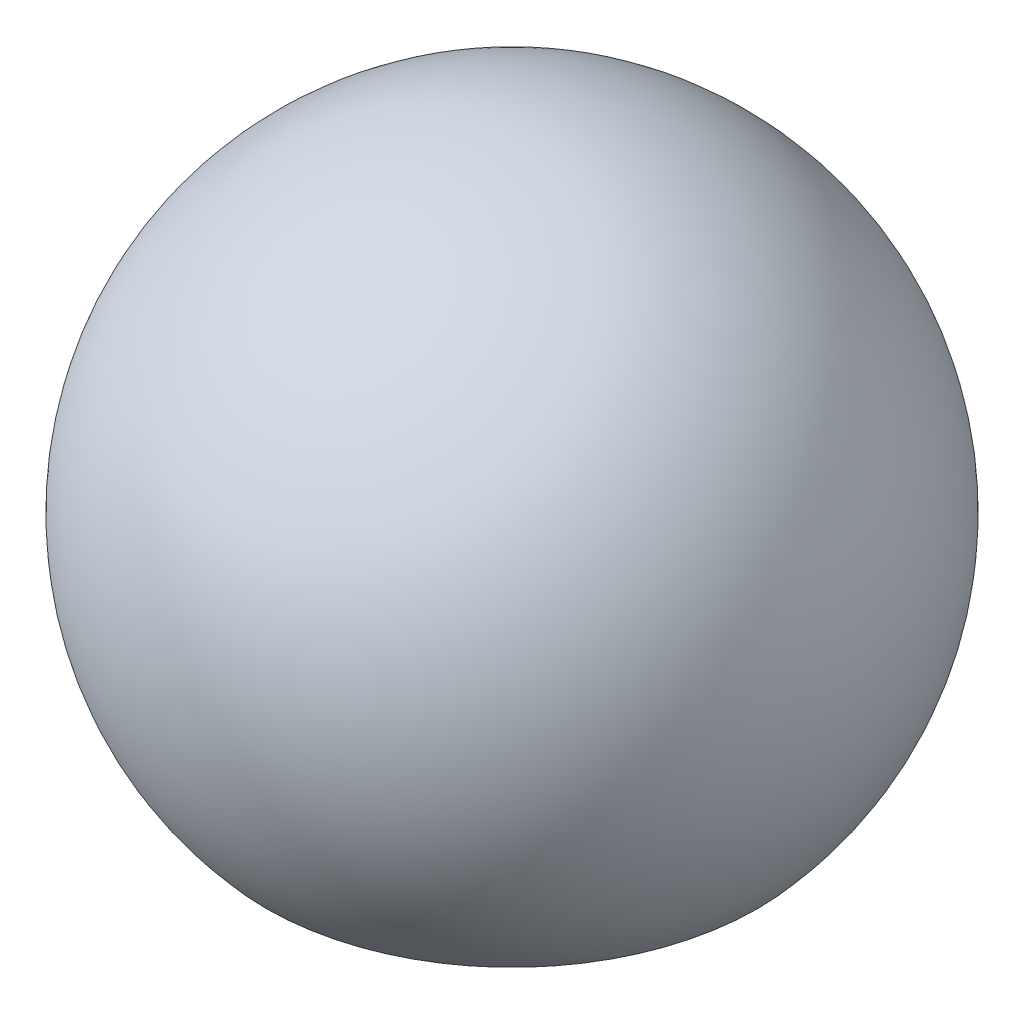
ISO-10303-21;
HEADER;
FILE_DESCRIPTION(('STEP AP214'),'2;1');
FILE_NAME('part.step','',(''),(''),'','','');
FILE_SCHEMA(('AUTOMOTIVE_DESIGN { 1 0 10303 214 1 1 1 1 }'));
ENDSEC;
DATA;
#1=APPLICATION_CONTEXT('core data for automotive mechanical design processes');
#2=APPLICATION_PROTOCOL_DEFINITION('international standard','automotive_design',2000,#1);
#3=PRODUCT_CONTEXT('',#1,'mechanical');
#4=PRODUCT('Part','Part','',(#3));
#5=PRODUCT_RELATED_PRODUCT_CATEGORY('part','',(#4));
#6=PRODUCT_DEFINITION_FORMATION('','',#4);
#7=PRODUCT_DEFINITION_CONTEXT('part definition',#1,'design');
#8=PRODUCT_DEFINITION('design','',#6,#7);
#9=PRODUCT_DEFINITION_SHAPE('','',#8);
#10=(LENGTH_UNIT() NAMED_UNIT(*) SI_UNIT(.MILLI.,.METRE.));
#11=(NAMED_UNIT(*) PLANE_ANGLE_UNIT() SI_UNIT($,.RADIAN.));
#12=(NAMED_UNIT(*) SI_UNIT($,.STERADIAN.) SOLID_ANGLE_UNIT());
#13=UNCERTAINTY_MEASURE_WITH_UNIT(LENGTH_MEASURE(1.E-05),#10,'distance_accuracy_value','');
#14=(GEOMETRIC_REPRESENTATION_CONTEXT(3) GLOBAL_UNCERTAINTY_ASSIGNED_CONTEXT((#13)) GLOBAL_UNIT_ASSIGNED_CONTEXT((#10,
#11,#12)) REPRESENTATION_CONTEXT('',''));
#15=CARTESIAN_POINT('',(0.,0.,0.));
#16=DIRECTION('',(0.,0.,1.));
#17=DIRECTION('',(1.,0.,0.));
#18=AXIS2_PLACEMENT_3D('',#15,#16,#17);
#19=CARTESIAN_POINT('',(0.,0.,0.));
#20=DIRECTION('',(0.,1.,0.));
#21=DIRECTION('',(1.,0.,0.));
#22=AXIS2_PLACEMENT_3D('',#19,#20,#21);
#23=SPHERICAL_SURFACE('',#22,12.);
#24=CARTESIAN_POINT('',(0.,-8.,0.));
#25=DIRECTION('',(0.,1.,0.));
#26=DIRECTION('',(-1.,0.,0.));
#27=AXIS2_PLACEMENT_3D('',#24,#25,#26);
#28=CIRCLE('',#27,8.94427190999915);
#29=CARTESIAN_POINT('',(-8.94427190999915,-8.00000000000001,0.));
#30=VERTEX_POINT('',#29);
#31=EDGE_CURVE('E10',#30,#30,#28,.T.);
#32=ORIENTED_EDGE('',*,*,#31,.T.);
#33=EDGE_LOOP('',(#32));
#34=FACE_BOUND('',#33,.T.);
#35=ADVANCED_FACE('F35',(#34),#23,.T.);
#36=CARTESIAN_POINT('',(0.,-8.,0.));
#37=DIRECTION('',(0.,1.,0.));
#38=DIRECTION('',(-1.,0.,0.));
#39=AXIS2_PLACEMENT_3D('',#36,#37,#38);
#40=PLANE('',#39);
#41=CARTESIAN_POINT('',(0.,-8.,0.));
#42=DIRECTION('',(0.,-1.,0.));
#43=DIRECTION('',(1.,0.,0.));
#44=AXIS2_PLACEMENT_3D('',#41,#42,#43);
#45=CIRCLE('',#44,4.);
#46=CARTESIAN_POINT('',(4.,-8.,0.));
#47=VERTEX_POINT('',#46);
#48=EDGE_CURVE('E45',#47,#47,#45,.T.);
#49=ORIENTED_EDGE('',*,*,#48,.F.);
#50=EDGE_LOOP('',(#49));
#51=FACE_BOUND('',#50,.T.);
#52=ORIENTED_EDGE('',*,*,#31,.F.);
#53=EDGE_LOOP('',(#52));
#54=FACE_BOUND('',#53,.T.);
#55=ADVANCED_FACE('F54',(#51,#54),#40,.F.);
#56=CARTESIAN_POINT('',(0.,4.,0.));
#57=DIRECTION('',(0.,-1.,0.));
#58=DIRECTION('',(1.,0.,0.));
#59=AXIS2_PLACEMENT_3D('',#56,#57,#58);
#60=CYLINDRICAL_SURFACE('',#59,4.);
#61=CARTESIAN_POINT('',(0.,4.,0.));
#62=DIRECTION('',(0.,-1.,0.));
#63=DIRECTION('',(1.,0.,0.));
#64=AXIS2_PLACEMENT_3D('',#61,#62,#63);
#65=CIRCLE('',#64,4.);
#66=CARTESIAN_POINT('',(4.,4.,0.));
#67=VERTEX_POINT('',#66);
#68=EDGE_CURVE('E41',#67,#67,#65,.T.);
#69=ORIENTED_EDGE('',*,*,#68,.F.);
#70=EDGE_LOOP('',(#69));
#71=FACE_BOUND('',#70,.T.);
#72=ORIENTED_EDGE('',*,*,#48,.T.);
#73=EDGE_LOOP('',(#72));
#74=FACE_BOUND('',#73,.T.);
#75=ADVANCED_FACE('F52',(#71,#74),#60,.F.);
#76=CARTESIAN_POINT('',(0.,4.,0.));
#77=DIRECTION('',(0.,-1.,0.));
#78=DIRECTION('',(1.,0.,0.));
#79=AXIS2_PLACEMENT_3D('',#76,#77,#78);
#80=PLANE('',#79);
#81=ORIENTED_EDGE('',*,*,#68,.T.);
#82=EDGE_LOOP('',(#81));
#83=FACE_BOUND('',#82,.T.);
#84=ADVANCED_FACE('F61',(#83),#80,.T.);
#85=CLOSED_SHELL('',(#35,#55,#75,#84));
#86=MANIFOLD_SOLID_BREP('B2',#85);
#87=ADVANCED_BREP_SHAPE_REPRESENTATION('',(#18,#86),#14);
#88=SHAPE_DEFINITION_REPRESENTATION(#9,#87);
ENDSEC;
END-ISO-10303-21;
